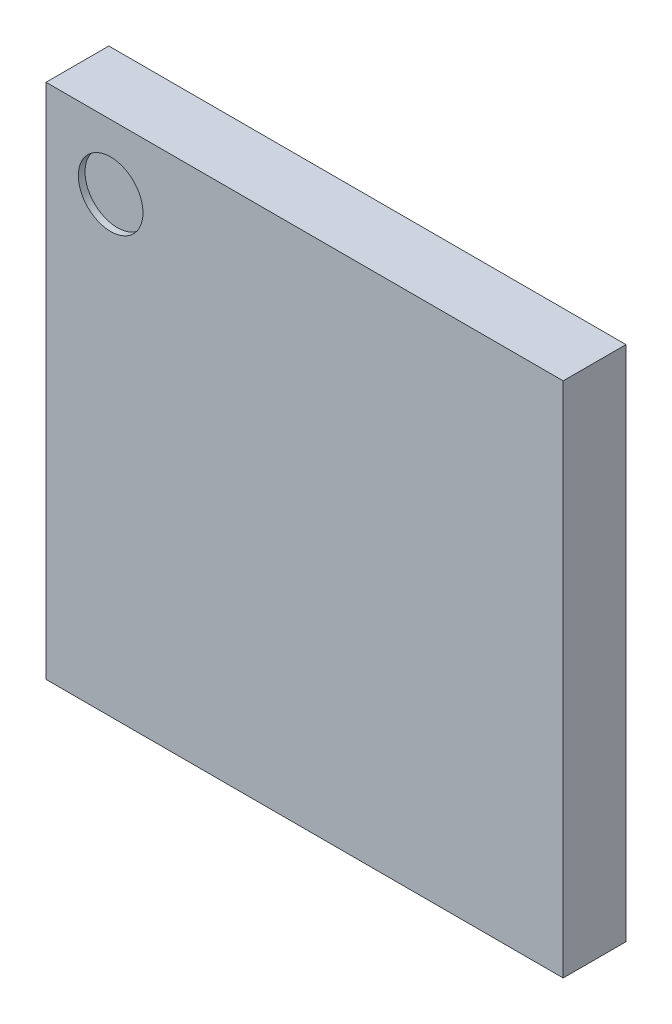
ISO-10303-21;
HEADER;
FILE_DESCRIPTION(('STEP AP214'),'2;1');
FILE_NAME('part.step','',(''),(''),'','','');
FILE_SCHEMA(('AUTOMOTIVE_DESIGN { 1 0 10303 214 1 1 1 1 }'));
ENDSEC;
DATA;
#1=APPLICATION_CONTEXT('core data for automotive mechanical design processes');
#2=APPLICATION_PROTOCOL_DEFINITION('international standard','automotive_design',2000,#1);
#3=PRODUCT_CONTEXT('',#1,'mechanical');
#4=PRODUCT('Part','Part','',(#3));
#5=PRODUCT_RELATED_PRODUCT_CATEGORY('part','',(#4));
#6=PRODUCT_DEFINITION_FORMATION('','',#4);
#7=PRODUCT_DEFINITION_CONTEXT('part definition',#1,'design');
#8=PRODUCT_DEFINITION('design','',#6,#7);
#9=PRODUCT_DEFINITION_SHAPE('','',#8);
#10=(LENGTH_UNIT() NAMED_UNIT(*) SI_UNIT(.MILLI.,.METRE.));
#11=(NAMED_UNIT(*) PLANE_ANGLE_UNIT() SI_UNIT($,.RADIAN.));
#12=(NAMED_UNIT(*) SI_UNIT($,.STERADIAN.) SOLID_ANGLE_UNIT());
#13=UNCERTAINTY_MEASURE_WITH_UNIT(LENGTH_MEASURE(1.E-05),#10,'distance_accuracy_value','');
#14=(GEOMETRIC_REPRESENTATION_CONTEXT(3) GLOBAL_UNCERTAINTY_ASSIGNED_CONTEXT((#13)) GLOBAL_UNIT_ASSIGNED_CONTEXT((#10,
#11,#12)) REPRESENTATION_CONTEXT('',''));
#15=CARTESIAN_POINT('',(0.,0.,0.));
#16=DIRECTION('',(0.,0.,1.));
#17=DIRECTION('',(1.,0.,0.));
#18=AXIS2_PLACEMENT_3D('',#15,#16,#17);
#19=CARTESIAN_POINT('',(-2.625,2.625,0.81));
#20=DIRECTION('',(0.,0.,1.));
#21=DIRECTION('',(1.,0.,0.));
#22=AXIS2_PLACEMENT_3D('',#19,#20,#21);
#23=PLANE('',#22);
#24=CARTESIAN_POINT('',(-2.625,2.625,0.81));
#25=DIRECTION('',(0.,0.,1.));
#26=DIRECTION('',(1.,0.,0.));
#27=AXIS2_PLACEMENT_3D('',#24,#25,#26);
#28=CIRCLE('',#27,0.4375);
#29=CARTESIAN_POINT('',(-2.1875,2.625,0.81));
#30=VERTEX_POINT('',#29);
#31=EDGE_CURVE('E20',#30,#30,#28,.T.);
#32=ORIENTED_EDGE('',*,*,#31,.T.);
#33=EDGE_LOOP('',(#32));
#34=FACE_BOUND('',#33,.T.);
#35=ADVANCED_FACE('F17',(#34),#23,.T.);
#36=CARTESIAN_POINT('',(-2.625,2.625,0.81));
#37=DIRECTION('',(0.,0.,1.));
#38=DIRECTION('',(1.,0.,0.));
#39=AXIS2_PLACEMENT_3D('',#36,#37,#38);
#40=CYLINDRICAL_SURFACE('',#39,0.4375);
#41=CARTESIAN_POINT('',(-2.625,2.625,0.9));
#42=DIRECTION('',(0.,0.,1.));
#43=DIRECTION('',(1.,0.,0.));
#44=AXIS2_PLACEMENT_3D('',#41,#42,#43);
#45=CIRCLE('',#44,0.4375);
#46=CARTESIAN_POINT('',(-2.1875,2.625,0.9));
#47=VERTEX_POINT('',#46);
#48=EDGE_CURVE('E69',#47,#47,#45,.F.);
#49=ORIENTED_EDGE('',*,*,#48,.F.);
#50=EDGE_LOOP('',(#49));
#51=FACE_BOUND('',#50,.T.);
#52=ORIENTED_EDGE('',*,*,#31,.F.);
#53=EDGE_LOOP('',(#52));
#54=FACE_BOUND('',#53,.T.);
#55=ADVANCED_FACE('F91',(#51,#54),#40,.F.);
#56=CARTESIAN_POINT('',(-3.5,-3.5,0.9));
#57=DIRECTION('',(0.,0.,1.));
#58=DIRECTION('',(1.,0.,0.));
#59=AXIS2_PLACEMENT_3D('',#56,#57,#58);
#60=PLANE('',#59);
#61=ORIENTED_EDGE('',*,*,#48,.T.);
#62=EDGE_LOOP('',(#61));
#63=FACE_BOUND('',#62,.T.);
#64=DIRECTION('',(0.,1.,0.));
#65=VECTOR('',#64,1.);
#66=CARTESIAN_POINT('',(3.5,-3.5,0.9));
#67=LINE('',#66,#65);
#68=CARTESIAN_POINT('',(3.5,3.5,0.9));
#69=VERTEX_POINT('',#68);
#70=CARTESIAN_POINT('',(3.5,-3.5,0.9));
#71=VERTEX_POINT('',#70);
#72=EDGE_CURVE('E175',#69,#71,#67,.F.);
#73=ORIENTED_EDGE('',*,*,#72,.F.);
#74=DIRECTION('',(1.,0.,0.));
#75=VECTOR('',#74,1.);
#76=CARTESIAN_POINT('',(-3.5,3.5,0.9));
#77=LINE('',#76,#75);
#78=CARTESIAN_POINT('',(-3.5,3.5,0.9));
#79=VERTEX_POINT('',#78);
#80=EDGE_CURVE('E62',#79,#69,#77,.T.);
#81=ORIENTED_EDGE('',*,*,#80,.F.);
#82=DIRECTION('',(0.,1.,0.));
#83=VECTOR('',#82,1.);
#84=CARTESIAN_POINT('',(-3.5,-3.5,0.9));
#85=LINE('',#84,#83);
#86=CARTESIAN_POINT('',(-3.5,-3.5,0.9));
#87=VERTEX_POINT('',#86);
#88=EDGE_CURVE('E60',#79,#87,#85,.F.);
#89=ORIENTED_EDGE('',*,*,#88,.T.);
#90=DIRECTION('',(1.,0.,0.));
#91=VECTOR('',#90,1.);
#92=CARTESIAN_POINT('',(-3.5,-3.5,0.9));
#93=LINE('',#92,#91);
#94=EDGE_CURVE('E57',#87,#71,#93,.T.);
#95=ORIENTED_EDGE('',*,*,#94,.T.);
#96=EDGE_LOOP('',(#73,#81,#89,#95));
#97=FACE_BOUND('',#96,.T.);
#98=ADVANCED_FACE('F61',(#63,#97),#60,.T.);
#99=CARTESIAN_POINT('',(-3.5,-3.5,0.05));
#100=DIRECTION('',(1.,0.,0.));
#101=DIRECTION('',(0.,0.,-1.));
#102=AXIS2_PLACEMENT_3D('',#99,#100,#101);
#103=PLANE('',#102);
#104=DIRECTION('',(0.,0.,1.));
#105=VECTOR('',#104,1.);
#106=CARTESIAN_POINT('',(-3.5,3.5,0.05));
#107=LINE('',#106,#105);
#108=CARTESIAN_POINT('',(-3.5,3.5,0.05));
#109=VERTEX_POINT('',#108);
#110=EDGE_CURVE('E180',#109,#79,#107,.T.);
#111=ORIENTED_EDGE('',*,*,#110,.F.);
#112=DIRECTION('',(0.,1.,0.));
#113=VECTOR('',#112,1.);
#114=CARTESIAN_POINT('',(-3.5,-3.5,0.05));
#115=LINE('',#114,#113);
#116=CARTESIAN_POINT('',(-3.5,-3.5,0.05));
#117=VERTEX_POINT('',#116);
#118=EDGE_CURVE('E81',#109,#117,#115,.F.);
#119=ORIENTED_EDGE('',*,*,#118,.T.);
#120=DIRECTION('',(0.,0.,1.));
#121=VECTOR('',#120,1.);
#122=CARTESIAN_POINT('',(-3.5,-3.5,0.05));
#123=LINE('',#122,#121);
#124=EDGE_CURVE('E68',#117,#87,#123,.T.);
#125=ORIENTED_EDGE('',*,*,#124,.T.);
#126=ORIENTED_EDGE('',*,*,#88,.F.);
#127=EDGE_LOOP('',(#111,#119,#125,#126));
#128=FACE_BOUND('',#127,.T.);
#129=ADVANCED_FACE('F80',(#128),#103,.F.);
#130=CARTESIAN_POINT('',(-3.5,-3.5,0.05));
#131=DIRECTION('',(0.,1.,0.));
#132=DIRECTION('',(0.,0.,1.));
#133=AXIS2_PLACEMENT_3D('',#130,#131,#132);
#134=PLANE('',#133);
#135=ORIENTED_EDGE('',*,*,#94,.F.);
#136=ORIENTED_EDGE('',*,*,#124,.F.);
#137=DIRECTION('',(1.,0.,0.));
#138=VECTOR('',#137,1.);
#139=CARTESIAN_POINT('',(-3.5,-3.5,0.05));
#140=LINE('',#139,#138);
#141=CARTESIAN_POINT('',(3.5,-3.5,0.05));
#142=VERTEX_POINT('',#141);
#143=EDGE_CURVE('E178',#117,#142,#140,.T.);
#144=ORIENTED_EDGE('',*,*,#143,.T.);
#145=DIRECTION('',(0.,0.,-1.));
#146=VECTOR('',#145,1.);
#147=CARTESIAN_POINT('',(3.5,-3.5,0.05));
#148=LINE('',#147,#146);
#149=EDGE_CURVE('E76',#71,#142,#148,.T.);
#150=ORIENTED_EDGE('',*,*,#149,.F.);
#151=EDGE_LOOP('',(#135,#136,#144,#150));
#152=FACE_BOUND('',#151,.T.);
#153=ADVANCED_FACE('F73',(#152),#134,.F.);
#154=CARTESIAN_POINT('',(3.5,-3.5,0.05));
#155=DIRECTION('',(1.,0.,0.));
#156=DIRECTION('',(0.,0.,-1.));
#157=AXIS2_PLACEMENT_3D('',#154,#155,#156);
#158=PLANE('',#157);
#159=DIRECTION('',(0.,0.,1.));
#160=VECTOR('',#159,1.);
#161=CARTESIAN_POINT('',(3.5,3.5,0.05));
#162=LINE('',#161,#160);
#163=CARTESIAN_POINT('',(3.5,3.5,0.05));
#164=VERTEX_POINT('',#163);
#165=EDGE_CURVE('E34',#69,#164,#162,.F.);
#166=ORIENTED_EDGE('',*,*,#165,.F.);
#167=ORIENTED_EDGE('',*,*,#72,.T.);
#168=ORIENTED_EDGE('',*,*,#149,.T.);
#169=DIRECTION('',(0.,1.,0.));
#170=VECTOR('',#169,1.);
#171=CARTESIAN_POINT('',(3.5,-3.5,0.05));
#172=LINE('',#171,#170);
#173=EDGE_CURVE('E26',#142,#164,#172,.T.);
#174=ORIENTED_EDGE('',*,*,#173,.T.);
#175=EDGE_LOOP('',(#166,#167,#168,#174));
#176=FACE_BOUND('',#175,.T.);
#177=ADVANCED_FACE('F108',(#176),#158,.T.);
#178=CARTESIAN_POINT('',(-3.5,3.5,0.05));
#179=DIRECTION('',(0.,1.,0.));
#180=DIRECTION('',(0.,0.,1.));
#181=AXIS2_PLACEMENT_3D('',#178,#179,#180);
#182=PLANE('',#181);
#183=ORIENTED_EDGE('',*,*,#80,.T.);
#184=ORIENTED_EDGE('',*,*,#165,.T.);
#185=DIRECTION('',(1.,0.,0.));
#186=VECTOR('',#185,1.);
#187=CARTESIAN_POINT('',(-3.5,3.5,0.05));
#188=LINE('',#187,#186);
#189=EDGE_CURVE('E11',#164,#109,#188,.F.);
#190=ORIENTED_EDGE('',*,*,#189,.T.);
#191=ORIENTED_EDGE('',*,*,#110,.T.);
#192=EDGE_LOOP('',(#183,#184,#190,#191));
#193=FACE_BOUND('',#192,.T.);
#194=ADVANCED_FACE('F102',(#193),#182,.T.);
#195=CARTESIAN_POINT('',(-3.5,-3.5,0.05));
#196=DIRECTION('',(0.,0.,1.));
#197=DIRECTION('',(1.,0.,0.));
#198=AXIS2_PLACEMENT_3D('',#195,#196,#197);
#199=PLANE('',#198);
#200=ORIENTED_EDGE('',*,*,#173,.F.);
#201=ORIENTED_EDGE('',*,*,#143,.F.);
#202=ORIENTED_EDGE('',*,*,#118,.F.);
#203=ORIENTED_EDGE('',*,*,#189,.F.);
#204=EDGE_LOOP('',(#200,#201,#202,#203));
#205=FACE_BOUND('',#204,.T.);
#206=ADVANCED_FACE('F100',(#205),#199,.F.);
#207=CLOSED_SHELL('',(#35,#55,#98,#129,#153,#177,#194,#206));
#208=MANIFOLD_SOLID_BREP('B1',#207);
#209=ADVANCED_BREP_SHAPE_REPRESENTATION('',(#18,#208),#14);
#210=SHAPE_DEFINITION_REPRESENTATION(#9,#209);
ENDSEC;
END-ISO-10303-21;
